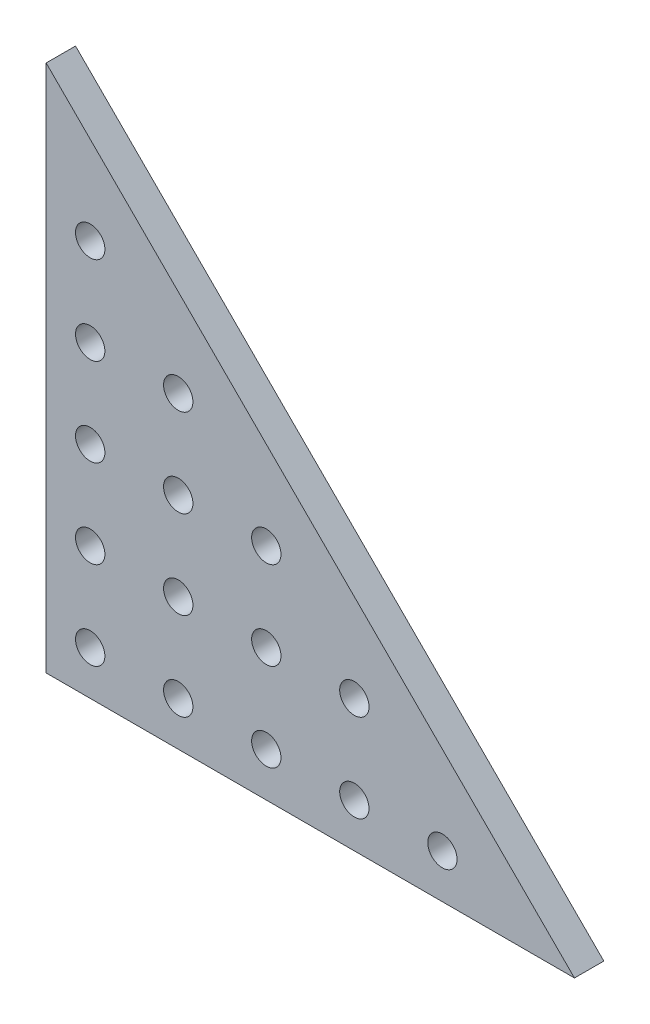
ISO-10303-21;
HEADER;
FILE_DESCRIPTION(('STEP AP214'),'2;1');
FILE_NAME('part.step','',(''),(''),'','','');
FILE_SCHEMA(('AUTOMOTIVE_DESIGN { 1 0 10303 214 1 1 1 1 }'));
ENDSEC;
DATA;
#1=APPLICATION_CONTEXT('core data for automotive mechanical design processes');
#2=APPLICATION_PROTOCOL_DEFINITION('international standard','automotive_design',2000,#1);
#3=PRODUCT_CONTEXT('',#1,'mechanical');
#4=PRODUCT('Part','Part','',(#3));
#5=PRODUCT_RELATED_PRODUCT_CATEGORY('part','',(#4));
#6=PRODUCT_DEFINITION_FORMATION('','',#4);
#7=PRODUCT_DEFINITION_CONTEXT('part definition',#1,'design');
#8=PRODUCT_DEFINITION('design','',#6,#7);
#9=PRODUCT_DEFINITION_SHAPE('','',#8);
#10=(LENGTH_UNIT() NAMED_UNIT(*) SI_UNIT(.MILLI.,.METRE.));
#11=(NAMED_UNIT(*) PLANE_ANGLE_UNIT() SI_UNIT($,.RADIAN.));
#12=(NAMED_UNIT(*) SI_UNIT($,.STERADIAN.) SOLID_ANGLE_UNIT());
#13=UNCERTAINTY_MEASURE_WITH_UNIT(LENGTH_MEASURE(1.E-05),#10,'distance_accuracy_value','');
#14=(GEOMETRIC_REPRESENTATION_CONTEXT(3) GLOBAL_UNCERTAINTY_ASSIGNED_CONTEXT((#13)) GLOBAL_UNIT_ASSIGNED_CONTEXT((#10,
#11,#12)) REPRESENTATION_CONTEXT('',''));
#15=CARTESIAN_POINT('',(0.,0.,0.));
#16=DIRECTION('',(0.,0.,1.));
#17=DIRECTION('',(1.,0.,0.));
#18=AXIS2_PLACEMENT_3D('',#15,#16,#17);
#19=CARTESIAN_POINT('',(0.,0.,3.));
#20=DIRECTION('',(0.,0.,1.));
#21=DIRECTION('',(1.,0.,0.));
#22=AXIS2_PLACEMENT_3D('',#19,#20,#21);
#23=PLANE('',#22);
#24=CARTESIAN_POINT('',(-74.443383637,56.056539338,3.));
#25=DIRECTION('',(0.,0.,1.));
#26=DIRECTION('',(1.,0.,0.));
#27=AXIS2_PLACEMENT_3D('',#24,#25,#26);
#28=CIRCLE('',#27,1.5);
#29=CARTESIAN_POINT('',(-72.943383637,56.056539338,3.));
#30=VERTEX_POINT('',#29);
#31=EDGE_CURVE('E136',#30,#30,#28,.T.);
#32=ORIENTED_EDGE('',*,*,#31,.F.);
#33=EDGE_LOOP('',(#32));
#34=FACE_BOUND('',#33,.T.);
#35=CARTESIAN_POINT('',(-92.443383637,56.056539338,3.));
#36=DIRECTION('',(0.,0.,1.));
#37=DIRECTION('',(1.,0.,0.));
#38=AXIS2_PLACEMENT_3D('',#35,#36,#37);
#39=CIRCLE('',#38,1.5);
#40=CARTESIAN_POINT('',(-90.943383637,56.056539338,3.));
#41=VERTEX_POINT('',#40);
#42=EDGE_CURVE('E146',#41,#41,#39,.T.);
#43=ORIENTED_EDGE('',*,*,#42,.F.);
#44=EDGE_LOOP('',(#43));
#45=FACE_BOUND('',#44,.T.);
#46=CARTESIAN_POINT('',(-74.443383637,65.056539338,3.));
#47=DIRECTION('',(0.,0.,1.));
#48=DIRECTION('',(1.,0.,0.));
#49=AXIS2_PLACEMENT_3D('',#46,#47,#48);
#50=CIRCLE('',#49,1.5);
#51=CARTESIAN_POINT('',(-72.943383637,65.056539338,3.));
#52=VERTEX_POINT('',#51);
#53=EDGE_CURVE('E156',#52,#52,#50,.T.);
#54=ORIENTED_EDGE('',*,*,#53,.F.);
#55=EDGE_LOOP('',(#54));
#56=FACE_BOUND('',#55,.T.);
#57=CARTESIAN_POINT('',(-92.443383637,65.056539338,3.));
#58=DIRECTION('',(0.,0.,1.));
#59=DIRECTION('',(1.,0.,0.));
#60=AXIS2_PLACEMENT_3D('',#57,#58,#59);
#61=CIRCLE('',#60,1.5);
#62=CARTESIAN_POINT('',(-90.943383637,65.056539338,3.));
#63=VERTEX_POINT('',#62);
#64=EDGE_CURVE('E166',#63,#63,#61,.T.);
#65=ORIENTED_EDGE('',*,*,#64,.F.);
#66=EDGE_LOOP('',(#65));
#67=FACE_BOUND('',#66,.T.);
#68=CARTESIAN_POINT('',(-83.443383637,74.056539338,3.));
#69=DIRECTION('',(0.,0.,1.));
#70=DIRECTION('',(1.,0.,0.));
#71=AXIS2_PLACEMENT_3D('',#68,#69,#70);
#72=CIRCLE('',#71,1.5);
#73=CARTESIAN_POINT('',(-81.943383637,74.056539338,3.));
#74=VERTEX_POINT('',#73);
#75=EDGE_CURVE('E176',#74,#74,#72,.T.);
#76=ORIENTED_EDGE('',*,*,#75,.F.);
#77=EDGE_LOOP('',(#76));
#78=FACE_BOUND('',#77,.T.);
#79=CARTESIAN_POINT('',(-101.443383637,74.056539338,3.));
#80=DIRECTION('',(0.,0.,1.));
#81=DIRECTION('',(1.,0.,0.));
#82=AXIS2_PLACEMENT_3D('',#79,#80,#81);
#83=CIRCLE('',#82,1.5);
#84=CARTESIAN_POINT('',(-99.943383637,74.056539338,3.));
#85=VERTEX_POINT('',#84);
#86=EDGE_CURVE('E186',#85,#85,#83,.T.);
#87=ORIENTED_EDGE('',*,*,#86,.F.);
#88=EDGE_LOOP('',(#87));
#89=FACE_BOUND('',#88,.T.);
#90=CARTESIAN_POINT('',(-101.443383637,83.056539338,3.));
#91=DIRECTION('',(0.,0.,1.));
#92=DIRECTION('',(1.,0.,0.));
#93=AXIS2_PLACEMENT_3D('',#90,#91,#92);
#94=CIRCLE('',#93,1.5);
#95=CARTESIAN_POINT('',(-99.943383637,83.056539338,3.));
#96=VERTEX_POINT('',#95);
#97=EDGE_CURVE('E196',#96,#96,#94,.T.);
#98=ORIENTED_EDGE('',*,*,#97,.F.);
#99=EDGE_LOOP('',(#98));
#100=FACE_BOUND('',#99,.T.);
#101=DIRECTION('',(-0.707106781186548,0.707106781186547,0.));
#102=VECTOR('',#101,1.);
#103=CARTESIAN_POINT('',(-105.943383637,105.556539338,3.));
#104=LINE('',#103,#102);
#105=CARTESIAN_POINT('',(-51.943383637,51.556539338,3.));
#106=VERTEX_POINT('',#105);
#107=CARTESIAN_POINT('',(-105.943383637,105.556539338,3.));
#108=VERTEX_POINT('',#107);
#109=EDGE_CURVE('E74',#106,#108,#104,.T.);
#110=ORIENTED_EDGE('',*,*,#109,.T.);
#111=DIRECTION('',(0.,-1.,0.));
#112=VECTOR('',#111,1.);
#113=CARTESIAN_POINT('',(-105.943383637,105.556539338,3.));
#114=LINE('',#113,#112);
#115=CARTESIAN_POINT('',(-105.943383637,51.556539338,3.));
#116=VERTEX_POINT('',#115);
#117=EDGE_CURVE('E70',#108,#116,#114,.T.);
#118=ORIENTED_EDGE('',*,*,#117,.T.);
#119=DIRECTION('',(1.,0.,0.));
#120=VECTOR('',#119,1.);
#121=CARTESIAN_POINT('',(-105.943383637,51.556539338,3.));
#122=LINE('',#121,#120);
#123=EDGE_CURVE('E50',#116,#106,#122,.T.);
#124=ORIENTED_EDGE('',*,*,#123,.T.);
#125=EDGE_LOOP('',(#110,#118,#124));
#126=FACE_BOUND('',#125,.T.);
#127=CARTESIAN_POINT('',(-101.443383637,92.056539338,3.));
#128=DIRECTION('',(0.,0.,1.));
#129=DIRECTION('',(1.,0.,0.));
#130=AXIS2_PLACEMENT_3D('',#127,#128,#129);
#131=CIRCLE('',#130,1.5);
#132=CARTESIAN_POINT('',(-99.943383637,92.056539338,3.));
#133=VERTEX_POINT('',#132);
#134=EDGE_CURVE('E84',#133,#133,#131,.T.);
#135=ORIENTED_EDGE('',*,*,#134,.F.);
#136=EDGE_LOOP('',(#135));
#137=FACE_BOUND('',#136,.T.);
#138=CARTESIAN_POINT('',(-92.443383637,83.056539338,3.));
#139=DIRECTION('',(0.,0.,1.));
#140=DIRECTION('',(1.,0.,0.));
#141=AXIS2_PLACEMENT_3D('',#138,#139,#140);
#142=CIRCLE('',#141,1.5);
#143=CARTESIAN_POINT('',(-90.943383637,83.056539338,3.));
#144=VERTEX_POINT('',#143);
#145=EDGE_CURVE('E191',#144,#144,#142,.T.);
#146=ORIENTED_EDGE('',*,*,#145,.F.);
#147=EDGE_LOOP('',(#146));
#148=FACE_BOUND('',#147,.T.);
#149=CARTESIAN_POINT('',(-92.443383637,74.056539338,3.));
#150=DIRECTION('',(0.,0.,1.));
#151=DIRECTION('',(1.,0.,0.));
#152=AXIS2_PLACEMENT_3D('',#149,#150,#151);
#153=CIRCLE('',#152,1.5);
#154=CARTESIAN_POINT('',(-90.943383637,74.056539338,3.));
#155=VERTEX_POINT('',#154);
#156=EDGE_CURVE('E181',#155,#155,#153,.T.);
#157=ORIENTED_EDGE('',*,*,#156,.F.);
#158=EDGE_LOOP('',(#157));
#159=FACE_BOUND('',#158,.T.);
#160=CARTESIAN_POINT('',(-101.443383637,65.056539338,3.));
#161=DIRECTION('',(0.,0.,1.));
#162=DIRECTION('',(1.,0.,0.));
#163=AXIS2_PLACEMENT_3D('',#160,#161,#162);
#164=CIRCLE('',#163,1.5);
#165=CARTESIAN_POINT('',(-99.943383637,65.056539338,3.));
#166=VERTEX_POINT('',#165);
#167=EDGE_CURVE('E171',#166,#166,#164,.T.);
#168=ORIENTED_EDGE('',*,*,#167,.F.);
#169=EDGE_LOOP('',(#168));
#170=FACE_BOUND('',#169,.T.);
#171=CARTESIAN_POINT('',(-83.443383637,65.056539338,3.));
#172=DIRECTION('',(0.,0.,1.));
#173=DIRECTION('',(1.,0.,0.));
#174=AXIS2_PLACEMENT_3D('',#171,#172,#173);
#175=CIRCLE('',#174,1.5);
#176=CARTESIAN_POINT('',(-81.943383637,65.056539338,3.));
#177=VERTEX_POINT('',#176);
#178=EDGE_CURVE('E161',#177,#177,#175,.T.);
#179=ORIENTED_EDGE('',*,*,#178,.F.);
#180=EDGE_LOOP('',(#179));
#181=FACE_BOUND('',#180,.T.);
#182=CARTESIAN_POINT('',(-101.443383637,56.056539338,3.));
#183=DIRECTION('',(0.,0.,1.));
#184=DIRECTION('',(1.,0.,0.));
#185=AXIS2_PLACEMENT_3D('',#182,#183,#184);
#186=CIRCLE('',#185,1.5);
#187=CARTESIAN_POINT('',(-99.943383637,56.056539338,3.));
#188=VERTEX_POINT('',#187);
#189=EDGE_CURVE('E151',#188,#188,#186,.T.);
#190=ORIENTED_EDGE('',*,*,#189,.F.);
#191=EDGE_LOOP('',(#190));
#192=FACE_BOUND('',#191,.T.);
#193=CARTESIAN_POINT('',(-83.443383637,56.056539338,3.));
#194=DIRECTION('',(0.,0.,1.));
#195=DIRECTION('',(1.,0.,0.));
#196=AXIS2_PLACEMENT_3D('',#193,#194,#195);
#197=CIRCLE('',#196,1.5);
#198=CARTESIAN_POINT('',(-81.943383637,56.056539338,3.));
#199=VERTEX_POINT('',#198);
#200=EDGE_CURVE('E141',#199,#199,#197,.T.);
#201=ORIENTED_EDGE('',*,*,#200,.F.);
#202=EDGE_LOOP('',(#201));
#203=FACE_BOUND('',#202,.T.);
#204=CARTESIAN_POINT('',(-65.443383637,56.056539338,3.));
#205=DIRECTION('',(0.,0.,1.));
#206=DIRECTION('',(1.,0.,0.));
#207=AXIS2_PLACEMENT_3D('',#204,#205,#206);
#208=CIRCLE('',#207,1.5);
#209=CARTESIAN_POINT('',(-63.943383637,56.056539338,3.));
#210=VERTEX_POINT('',#209);
#211=EDGE_CURVE('E130',#210,#210,#208,.T.);
#212=ORIENTED_EDGE('',*,*,#211,.F.);
#213=EDGE_LOOP('',(#212));
#214=FACE_BOUND('',#213,.T.);
#215=ADVANCED_FACE('F33',(#34,#45,#56,#67,#78,#89,#100,#126,#137,#148,#159,#170,#181,#192,#203,
#214),#23,.T.);
#216=CARTESIAN_POINT('',(0.,0.,0.));
#217=DIRECTION('',(0.,0.,1.));
#218=DIRECTION('',(1.,0.,0.));
#219=AXIS2_PLACEMENT_3D('',#216,#217,#218);
#220=PLANE('',#219);
#221=CARTESIAN_POINT('',(-74.443383637,56.056539338,0.));
#222=DIRECTION('',(0.,0.,1.));
#223=DIRECTION('',(1.,0.,0.));
#224=AXIS2_PLACEMENT_3D('',#221,#222,#223);
#225=CIRCLE('',#224,1.5);
#226=CARTESIAN_POINT('',(-72.943383637,56.056539338,0.));
#227=VERTEX_POINT('',#226);
#228=EDGE_CURVE('E133',#227,#227,#225,.T.);
#229=ORIENTED_EDGE('',*,*,#228,.T.);
#230=EDGE_LOOP('',(#229));
#231=FACE_BOUND('',#230,.T.);
#232=CARTESIAN_POINT('',(-92.443383637,56.056539338,0.));
#233=DIRECTION('',(0.,0.,1.));
#234=DIRECTION('',(1.,0.,0.));
#235=AXIS2_PLACEMENT_3D('',#232,#233,#234);
#236=CIRCLE('',#235,1.5);
#237=CARTESIAN_POINT('',(-90.943383637,56.056539338,0.));
#238=VERTEX_POINT('',#237);
#239=EDGE_CURVE('E144',#238,#238,#236,.T.);
#240=ORIENTED_EDGE('',*,*,#239,.T.);
#241=EDGE_LOOP('',(#240));
#242=FACE_BOUND('',#241,.T.);
#243=CARTESIAN_POINT('',(-74.443383637,65.056539338,0.));
#244=DIRECTION('',(0.,0.,1.));
#245=DIRECTION('',(1.,0.,0.));
#246=AXIS2_PLACEMENT_3D('',#243,#244,#245);
#247=CIRCLE('',#246,1.5);
#248=CARTESIAN_POINT('',(-72.943383637,65.056539338,0.));
#249=VERTEX_POINT('',#248);
#250=EDGE_CURVE('E154',#249,#249,#247,.T.);
#251=ORIENTED_EDGE('',*,*,#250,.T.);
#252=EDGE_LOOP('',(#251));
#253=FACE_BOUND('',#252,.T.);
#254=CARTESIAN_POINT('',(-92.443383637,65.056539338,0.));
#255=DIRECTION('',(0.,0.,1.));
#256=DIRECTION('',(1.,0.,0.));
#257=AXIS2_PLACEMENT_3D('',#254,#255,#256);
#258=CIRCLE('',#257,1.5);
#259=CARTESIAN_POINT('',(-90.943383637,65.056539338,0.));
#260=VERTEX_POINT('',#259);
#261=EDGE_CURVE('E164',#260,#260,#258,.T.);
#262=ORIENTED_EDGE('',*,*,#261,.T.);
#263=EDGE_LOOP('',(#262));
#264=FACE_BOUND('',#263,.T.);
#265=CARTESIAN_POINT('',(-83.443383637,74.056539338,0.));
#266=DIRECTION('',(0.,0.,1.));
#267=DIRECTION('',(1.,0.,0.));
#268=AXIS2_PLACEMENT_3D('',#265,#266,#267);
#269=CIRCLE('',#268,1.5);
#270=CARTESIAN_POINT('',(-81.943383637,74.056539338,0.));
#271=VERTEX_POINT('',#270);
#272=EDGE_CURVE('E174',#271,#271,#269,.T.);
#273=ORIENTED_EDGE('',*,*,#272,.T.);
#274=EDGE_LOOP('',(#273));
#275=FACE_BOUND('',#274,.T.);
#276=CARTESIAN_POINT('',(-101.443383637,74.056539338,0.));
#277=DIRECTION('',(0.,0.,1.));
#278=DIRECTION('',(1.,0.,0.));
#279=AXIS2_PLACEMENT_3D('',#276,#277,#278);
#280=CIRCLE('',#279,1.5);
#281=CARTESIAN_POINT('',(-99.943383637,74.056539338,0.));
#282=VERTEX_POINT('',#281);
#283=EDGE_CURVE('E184',#282,#282,#280,.T.);
#284=ORIENTED_EDGE('',*,*,#283,.T.);
#285=EDGE_LOOP('',(#284));
#286=FACE_BOUND('',#285,.T.);
#287=CARTESIAN_POINT('',(-101.443383637,83.056539338,0.));
#288=DIRECTION('',(0.,0.,1.));
#289=DIRECTION('',(1.,0.,0.));
#290=AXIS2_PLACEMENT_3D('',#287,#288,#289);
#291=CIRCLE('',#290,1.5);
#292=CARTESIAN_POINT('',(-99.943383637,83.056539338,0.));
#293=VERTEX_POINT('',#292);
#294=EDGE_CURVE('E194',#293,#293,#291,.T.);
#295=ORIENTED_EDGE('',*,*,#294,.T.);
#296=EDGE_LOOP('',(#295));
#297=FACE_BOUND('',#296,.T.);
#298=DIRECTION('',(-0.707106781186548,0.707106781186547,0.));
#299=VECTOR('',#298,1.);
#300=CARTESIAN_POINT('',(-105.943383637,105.556539338,0.));
#301=LINE('',#300,#299);
#302=CARTESIAN_POINT('',(-51.943383637,51.556539338,0.));
#303=VERTEX_POINT('',#302);
#304=CARTESIAN_POINT('',(-105.943383637,105.556539338,0.));
#305=VERTEX_POINT('',#304);
#306=EDGE_CURVE('E81',#303,#305,#301,.T.);
#307=ORIENTED_EDGE('',*,*,#306,.F.);
#308=DIRECTION('',(1.,0.,0.));
#309=VECTOR('',#308,1.);
#310=CARTESIAN_POINT('',(-105.943383637,51.556539338,0.));
#311=LINE('',#310,#309);
#312=CARTESIAN_POINT('',(-105.943383637,51.556539338,0.));
#313=VERTEX_POINT('',#312);
#314=EDGE_CURVE('E67',#313,#303,#311,.T.);
#315=ORIENTED_EDGE('',*,*,#314,.F.);
#316=DIRECTION('',(0.,-1.,0.));
#317=VECTOR('',#316,1.);
#318=CARTESIAN_POINT('',(-105.943383637,105.556539338,0.));
#319=LINE('',#318,#317);
#320=EDGE_CURVE('E62',#305,#313,#319,.T.);
#321=ORIENTED_EDGE('',*,*,#320,.F.);
#322=EDGE_LOOP('',(#307,#315,#321));
#323=FACE_BOUND('',#322,.T.);
#324=CARTESIAN_POINT('',(-101.443383637,92.056539338,0.));
#325=DIRECTION('',(0.,0.,1.));
#326=DIRECTION('',(1.,0.,0.));
#327=AXIS2_PLACEMENT_3D('',#324,#325,#326);
#328=CIRCLE('',#327,1.5);
#329=CARTESIAN_POINT('',(-99.943383637,92.056539338,0.));
#330=VERTEX_POINT('',#329);
#331=EDGE_CURVE('E88',#330,#330,#328,.T.);
#332=ORIENTED_EDGE('',*,*,#331,.T.);
#333=EDGE_LOOP('',(#332));
#334=FACE_BOUND('',#333,.T.);
#335=CARTESIAN_POINT('',(-92.443383637,83.056539338,0.));
#336=DIRECTION('',(0.,0.,1.));
#337=DIRECTION('',(1.,0.,0.));
#338=AXIS2_PLACEMENT_3D('',#335,#336,#337);
#339=CIRCLE('',#338,1.5);
#340=CARTESIAN_POINT('',(-90.943383637,83.056539338,0.));
#341=VERTEX_POINT('',#340);
#342=EDGE_CURVE('E105',#341,#341,#339,.T.);
#343=ORIENTED_EDGE('',*,*,#342,.T.);
#344=EDGE_LOOP('',(#343));
#345=FACE_BOUND('',#344,.T.);
#346=CARTESIAN_POINT('',(-92.443383637,74.056539338,0.));
#347=DIRECTION('',(0.,0.,1.));
#348=DIRECTION('',(1.,0.,0.));
#349=AXIS2_PLACEMENT_3D('',#346,#347,#348);
#350=CIRCLE('',#349,1.5);
#351=CARTESIAN_POINT('',(-90.943383637,74.056539338,0.));
#352=VERTEX_POINT('',#351);
#353=EDGE_CURVE('E109',#352,#352,#350,.T.);
#354=ORIENTED_EDGE('',*,*,#353,.T.);
#355=EDGE_LOOP('',(#354));
#356=FACE_BOUND('',#355,.T.);
#357=CARTESIAN_POINT('',(-101.443383637,65.056539338,0.));
#358=DIRECTION('',(0.,0.,1.));
#359=DIRECTION('',(1.,0.,0.));
#360=AXIS2_PLACEMENT_3D('',#357,#358,#359);
#361=CIRCLE('',#360,1.5);
#362=CARTESIAN_POINT('',(-99.943383637,65.056539338,0.));
#363=VERTEX_POINT('',#362);
#364=EDGE_CURVE('E113',#363,#363,#361,.T.);
#365=ORIENTED_EDGE('',*,*,#364,.T.);
#366=EDGE_LOOP('',(#365));
#367=FACE_BOUND('',#366,.T.);
#368=CARTESIAN_POINT('',(-83.443383637,65.056539338,0.));
#369=DIRECTION('',(0.,0.,1.));
#370=DIRECTION('',(1.,0.,0.));
#371=AXIS2_PLACEMENT_3D('',#368,#369,#370);
#372=CIRCLE('',#371,1.5);
#373=CARTESIAN_POINT('',(-81.943383637,65.056539338,0.));
#374=VERTEX_POINT('',#373);
#375=EDGE_CURVE('E117',#374,#374,#372,.T.);
#376=ORIENTED_EDGE('',*,*,#375,.T.);
#377=EDGE_LOOP('',(#376));
#378=FACE_BOUND('',#377,.T.);
#379=CARTESIAN_POINT('',(-101.443383637,56.056539338,0.));
#380=DIRECTION('',(0.,0.,1.));
#381=DIRECTION('',(1.,0.,0.));
#382=AXIS2_PLACEMENT_3D('',#379,#380,#381);
#383=CIRCLE('',#382,1.5);
#384=CARTESIAN_POINT('',(-99.943383637,56.056539338,0.));
#385=VERTEX_POINT('',#384);
#386=EDGE_CURVE('E121',#385,#385,#383,.T.);
#387=ORIENTED_EDGE('',*,*,#386,.T.);
#388=EDGE_LOOP('',(#387));
#389=FACE_BOUND('',#388,.T.);
#390=CARTESIAN_POINT('',(-83.443383637,56.056539338,0.));
#391=DIRECTION('',(0.,0.,1.));
#392=DIRECTION('',(1.,0.,0.));
#393=AXIS2_PLACEMENT_3D('',#390,#391,#392);
#394=CIRCLE('',#393,1.5);
#395=CARTESIAN_POINT('',(-81.943383637,56.056539338,0.));
#396=VERTEX_POINT('',#395);
#397=EDGE_CURVE('E125',#396,#396,#394,.T.);
#398=ORIENTED_EDGE('',*,*,#397,.T.);
#399=EDGE_LOOP('',(#398));
#400=FACE_BOUND('',#399,.T.);
#401=CARTESIAN_POINT('',(-65.443383637,56.056539338,0.));
#402=DIRECTION('',(0.,0.,1.));
#403=DIRECTION('',(1.,0.,0.));
#404=AXIS2_PLACEMENT_3D('',#401,#402,#403);
#405=CIRCLE('',#404,1.5);
#406=CARTESIAN_POINT('',(-63.943383637,56.056539338,0.));
#407=VERTEX_POINT('',#406);
#408=EDGE_CURVE('E128',#407,#407,#405,.T.);
#409=ORIENTED_EDGE('',*,*,#408,.T.);
#410=EDGE_LOOP('',(#409));
#411=FACE_BOUND('',#410,.T.);
#412=ADVANCED_FACE('F94',(#231,#242,#253,#264,#275,#286,#297,#323,#334,#345,#356,#367,#378,#389,
#400,#411),#220,.F.);
#413=CARTESIAN_POINT('',(-105.943383637,105.556539338,3.));
#414=DIRECTION('',(-0.707106781186547,-0.707106781186548,0.));
#415=DIRECTION('',(0.707106781186548,-0.707106781186547,0.));
#416=AXIS2_PLACEMENT_3D('',#413,#414,#415);
#417=PLANE('',#416);
#418=ORIENTED_EDGE('',*,*,#306,.T.);
#419=DIRECTION('',(0.,0.,-1.));
#420=VECTOR('',#419,1.);
#421=CARTESIAN_POINT('',(-105.943383637,105.556539338,3.));
#422=LINE('',#421,#420);
#423=EDGE_CURVE('E11',#108,#305,#422,.T.);
#424=ORIENTED_EDGE('',*,*,#423,.F.);
#425=ORIENTED_EDGE('',*,*,#109,.F.);
#426=DIRECTION('',(0.,0.,-1.));
#427=VECTOR('',#426,1.);
#428=CARTESIAN_POINT('',(-51.943383637,51.556539338,3.));
#429=LINE('',#428,#427);
#430=EDGE_CURVE('E82',#106,#303,#429,.T.);
#431=ORIENTED_EDGE('',*,*,#430,.T.);
#432=EDGE_LOOP('',(#418,#424,#425,#431));
#433=FACE_BOUND('',#432,.T.);
#434=ADVANCED_FACE('F35',(#433),#417,.F.);
#435=CARTESIAN_POINT('',(-105.943383637,105.556539338,3.));
#436=DIRECTION('',(1.,0.,0.));
#437=DIRECTION('',(0.,0.,-1.));
#438=AXIS2_PLACEMENT_3D('',#435,#436,#437);
#439=PLANE('',#438);
#440=ORIENTED_EDGE('',*,*,#320,.T.);
#441=DIRECTION('',(0.,0.,-1.));
#442=VECTOR('',#441,1.);
#443=CARTESIAN_POINT('',(-105.943383637,51.556539338,3.));
#444=LINE('',#443,#442);
#445=EDGE_CURVE('E42',#116,#313,#444,.T.);
#446=ORIENTED_EDGE('',*,*,#445,.F.);
#447=ORIENTED_EDGE('',*,*,#117,.F.);
#448=ORIENTED_EDGE('',*,*,#423,.T.);
#449=EDGE_LOOP('',(#440,#446,#447,#448));
#450=FACE_BOUND('',#449,.T.);
#451=ADVANCED_FACE('F71',(#450),#439,.F.);
#452=CARTESIAN_POINT('',(-105.943383637,51.556539338,3.));
#453=DIRECTION('',(0.,1.,0.));
#454=DIRECTION('',(0.,0.,1.));
#455=AXIS2_PLACEMENT_3D('',#452,#453,#454);
#456=PLANE('',#455);
#457=ORIENTED_EDGE('',*,*,#314,.T.);
#458=ORIENTED_EDGE('',*,*,#430,.F.);
#459=ORIENTED_EDGE('',*,*,#123,.F.);
#460=ORIENTED_EDGE('',*,*,#445,.T.);
#461=EDGE_LOOP('',(#457,#458,#459,#460));
#462=FACE_BOUND('',#461,.T.);
#463=ADVANCED_FACE('F93',(#462),#456,.F.);
#464=CARTESIAN_POINT('',(-101.443383637,92.056539338,3.));
#465=DIRECTION('',(0.,0.,-1.));
#466=DIRECTION('',(-1.,0.,0.));
#467=AXIS2_PLACEMENT_3D('',#464,#465,#466);
#468=CYLINDRICAL_SURFACE('',#467,1.5);
#469=ORIENTED_EDGE('',*,*,#134,.T.);
#470=EDGE_LOOP('',(#469));
#471=FACE_BOUND('',#470,.T.);
#472=ORIENTED_EDGE('',*,*,#331,.F.);
#473=EDGE_LOOP('',(#472));
#474=FACE_BOUND('',#473,.T.);
#475=ADVANCED_FACE('F207',(#471,#474),#468,.F.);
#476=CARTESIAN_POINT('',(-101.443383637,83.056539338,3.));
#477=DIRECTION('',(0.,0.,-1.));
#478=DIRECTION('',(-1.,0.,0.));
#479=AXIS2_PLACEMENT_3D('',#476,#477,#478);
#480=CYLINDRICAL_SURFACE('',#479,1.5);
#481=ORIENTED_EDGE('',*,*,#97,.T.);
#482=EDGE_LOOP('',(#481));
#483=FACE_BOUND('',#482,.T.);
#484=ORIENTED_EDGE('',*,*,#294,.F.);
#485=EDGE_LOOP('',(#484));
#486=FACE_BOUND('',#485,.T.);
#487=ADVANCED_FACE('F204',(#483,#486),#480,.F.);
#488=CARTESIAN_POINT('',(-92.443383637,83.056539338,3.));
#489=DIRECTION('',(0.,0.,-1.));
#490=DIRECTION('',(-1.,0.,0.));
#491=AXIS2_PLACEMENT_3D('',#488,#489,#490);
#492=CYLINDRICAL_SURFACE('',#491,1.5);
#493=ORIENTED_EDGE('',*,*,#145,.T.);
#494=EDGE_LOOP('',(#493));
#495=FACE_BOUND('',#494,.T.);
#496=ORIENTED_EDGE('',*,*,#342,.F.);
#497=EDGE_LOOP('',(#496));
#498=FACE_BOUND('',#497,.T.);
#499=ADVANCED_FACE('F206',(#495,#498),#492,.F.);
#500=CARTESIAN_POINT('',(-101.443383637,74.056539338,3.));
#501=DIRECTION('',(0.,0.,-1.));
#502=DIRECTION('',(-1.,0.,0.));
#503=AXIS2_PLACEMENT_3D('',#500,#501,#502);
#504=CYLINDRICAL_SURFACE('',#503,1.5);
#505=ORIENTED_EDGE('',*,*,#86,.T.);
#506=EDGE_LOOP('',(#505));
#507=FACE_BOUND('',#506,.T.);
#508=ORIENTED_EDGE('',*,*,#283,.F.);
#509=EDGE_LOOP('',(#508));
#510=FACE_BOUND('',#509,.T.);
#511=ADVANCED_FACE('F214',(#507,#510),#504,.F.);
#512=CARTESIAN_POINT('',(-92.443383637,74.056539338,3.));
#513=DIRECTION('',(0.,0.,-1.));
#514=DIRECTION('',(-1.,0.,0.));
#515=AXIS2_PLACEMENT_3D('',#512,#513,#514);
#516=CYLINDRICAL_SURFACE('',#515,1.5);
#517=ORIENTED_EDGE('',*,*,#156,.T.);
#518=EDGE_LOOP('',(#517));
#519=FACE_BOUND('',#518,.T.);
#520=ORIENTED_EDGE('',*,*,#353,.F.);
#521=EDGE_LOOP('',(#520));
#522=FACE_BOUND('',#521,.T.);
#523=ADVANCED_FACE('F277',(#519,#522),#516,.F.);
#524=CARTESIAN_POINT('',(-83.443383637,74.056539338,3.));
#525=DIRECTION('',(0.,0.,-1.));
#526=DIRECTION('',(-1.,0.,0.));
#527=AXIS2_PLACEMENT_3D('',#524,#525,#526);
#528=CYLINDRICAL_SURFACE('',#527,1.5);
#529=ORIENTED_EDGE('',*,*,#75,.T.);
#530=EDGE_LOOP('',(#529));
#531=FACE_BOUND('',#530,.T.);
#532=ORIENTED_EDGE('',*,*,#272,.F.);
#533=EDGE_LOOP('',(#532));
#534=FACE_BOUND('',#533,.T.);
#535=ADVANCED_FACE('F286',(#531,#534),#528,.F.);
#536=CARTESIAN_POINT('',(-101.443383637,65.056539338,3.));
#537=DIRECTION('',(0.,0.,-1.));
#538=DIRECTION('',(-1.,0.,0.));
#539=AXIS2_PLACEMENT_3D('',#536,#537,#538);
#540=CYLINDRICAL_SURFACE('',#539,1.5);
#541=ORIENTED_EDGE('',*,*,#167,.T.);
#542=EDGE_LOOP('',(#541));
#543=FACE_BOUND('',#542,.T.);
#544=ORIENTED_EDGE('',*,*,#364,.F.);
#545=EDGE_LOOP('',(#544));
#546=FACE_BOUND('',#545,.T.);
#547=ADVANCED_FACE('F295',(#543,#546),#540,.F.);
#548=CARTESIAN_POINT('',(-92.443383637,65.056539338,3.));
#549=DIRECTION('',(0.,0.,-1.));
#550=DIRECTION('',(-1.,0.,0.));
#551=AXIS2_PLACEMENT_3D('',#548,#549,#550);
#552=CYLINDRICAL_SURFACE('',#551,1.5);
#553=ORIENTED_EDGE('',*,*,#64,.T.);
#554=EDGE_LOOP('',(#553));
#555=FACE_BOUND('',#554,.T.);
#556=ORIENTED_EDGE('',*,*,#261,.F.);
#557=EDGE_LOOP('',(#556));
#558=FACE_BOUND('',#557,.T.);
#559=ADVANCED_FACE('F304',(#555,#558),#552,.F.);
#560=CARTESIAN_POINT('',(-83.443383637,65.056539338,3.));
#561=DIRECTION('',(0.,0.,-1.));
#562=DIRECTION('',(-1.,0.,0.));
#563=AXIS2_PLACEMENT_3D('',#560,#561,#562);
#564=CYLINDRICAL_SURFACE('',#563,1.5);
#565=ORIENTED_EDGE('',*,*,#178,.T.);
#566=EDGE_LOOP('',(#565));
#567=FACE_BOUND('',#566,.T.);
#568=ORIENTED_EDGE('',*,*,#375,.F.);
#569=EDGE_LOOP('',(#568));
#570=FACE_BOUND('',#569,.T.);
#571=ADVANCED_FACE('F313',(#567,#570),#564,.F.);
#572=CARTESIAN_POINT('',(-74.443383637,65.056539338,3.));
#573=DIRECTION('',(0.,0.,-1.));
#574=DIRECTION('',(-1.,0.,0.));
#575=AXIS2_PLACEMENT_3D('',#572,#573,#574);
#576=CYLINDRICAL_SURFACE('',#575,1.5);
#577=ORIENTED_EDGE('',*,*,#53,.T.);
#578=EDGE_LOOP('',(#577));
#579=FACE_BOUND('',#578,.T.);
#580=ORIENTED_EDGE('',*,*,#250,.F.);
#581=EDGE_LOOP('',(#580));
#582=FACE_BOUND('',#581,.T.);
#583=ADVANCED_FACE('F322',(#579,#582),#576,.F.);
#584=CARTESIAN_POINT('',(-101.443383637,56.056539338,3.));
#585=DIRECTION('',(0.,0.,-1.));
#586=DIRECTION('',(-1.,0.,0.));
#587=AXIS2_PLACEMENT_3D('',#584,#585,#586);
#588=CYLINDRICAL_SURFACE('',#587,1.5);
#589=ORIENTED_EDGE('',*,*,#189,.T.);
#590=EDGE_LOOP('',(#589));
#591=FACE_BOUND('',#590,.T.);
#592=ORIENTED_EDGE('',*,*,#386,.F.);
#593=EDGE_LOOP('',(#592));
#594=FACE_BOUND('',#593,.T.);
#595=ADVANCED_FACE('F331',(#591,#594),#588,.F.);
#596=CARTESIAN_POINT('',(-92.443383637,56.056539338,3.));
#597=DIRECTION('',(0.,0.,-1.));
#598=DIRECTION('',(-1.,0.,0.));
#599=AXIS2_PLACEMENT_3D('',#596,#597,#598);
#600=CYLINDRICAL_SURFACE('',#599,1.5);
#601=ORIENTED_EDGE('',*,*,#42,.T.);
#602=EDGE_LOOP('',(#601));
#603=FACE_BOUND('',#602,.T.);
#604=ORIENTED_EDGE('',*,*,#239,.F.);
#605=EDGE_LOOP('',(#604));
#606=FACE_BOUND('',#605,.T.);
#607=ADVANCED_FACE('F340',(#603,#606),#600,.F.);
#608=CARTESIAN_POINT('',(-83.443383637,56.056539338,3.));
#609=DIRECTION('',(0.,0.,-1.));
#610=DIRECTION('',(-1.,0.,0.));
#611=AXIS2_PLACEMENT_3D('',#608,#609,#610);
#612=CYLINDRICAL_SURFACE('',#611,1.5);
#613=ORIENTED_EDGE('',*,*,#200,.T.);
#614=EDGE_LOOP('',(#613));
#615=FACE_BOUND('',#614,.T.);
#616=ORIENTED_EDGE('',*,*,#397,.F.);
#617=EDGE_LOOP('',(#616));
#618=FACE_BOUND('',#617,.T.);
#619=ADVANCED_FACE('F349',(#615,#618),#612,.F.);
#620=CARTESIAN_POINT('',(-74.443383637,56.056539338,3.));
#621=DIRECTION('',(0.,0.,-1.));
#622=DIRECTION('',(-1.,0.,0.));
#623=AXIS2_PLACEMENT_3D('',#620,#621,#622);
#624=CYLINDRICAL_SURFACE('',#623,1.5);
#625=ORIENTED_EDGE('',*,*,#31,.T.);
#626=EDGE_LOOP('',(#625));
#627=FACE_BOUND('',#626,.T.);
#628=ORIENTED_EDGE('',*,*,#228,.F.);
#629=EDGE_LOOP('',(#628));
#630=FACE_BOUND('',#629,.T.);
#631=ADVANCED_FACE('F358',(#627,#630),#624,.F.);
#632=CARTESIAN_POINT('',(-65.443383637,56.056539338,3.));
#633=DIRECTION('',(0.,0.,-1.));
#634=DIRECTION('',(-1.,0.,0.));
#635=AXIS2_PLACEMENT_3D('',#632,#633,#634);
#636=CYLINDRICAL_SURFACE('',#635,1.5);
#637=ORIENTED_EDGE('',*,*,#211,.T.);
#638=EDGE_LOOP('',(#637));
#639=FACE_BOUND('',#638,.T.);
#640=ORIENTED_EDGE('',*,*,#408,.F.);
#641=EDGE_LOOP('',(#640));
#642=FACE_BOUND('',#641,.T.);
#643=ADVANCED_FACE('F367',(#639,#642),#636,.F.);
#644=CLOSED_SHELL('',(#215,#412,#434,#451,#463,#475,#487,#499,#511,#523,#535,#547,#559,#571,
#583,#595,#607,#619,#631,#643));
#645=MANIFOLD_SOLID_BREP('B2',#644);
#646=ADVANCED_BREP_SHAPE_REPRESENTATION('',(#18,#645),#14);
#647=SHAPE_DEFINITION_REPRESENTATION(#9,#646);
ENDSEC;
END-ISO-10303-21;
